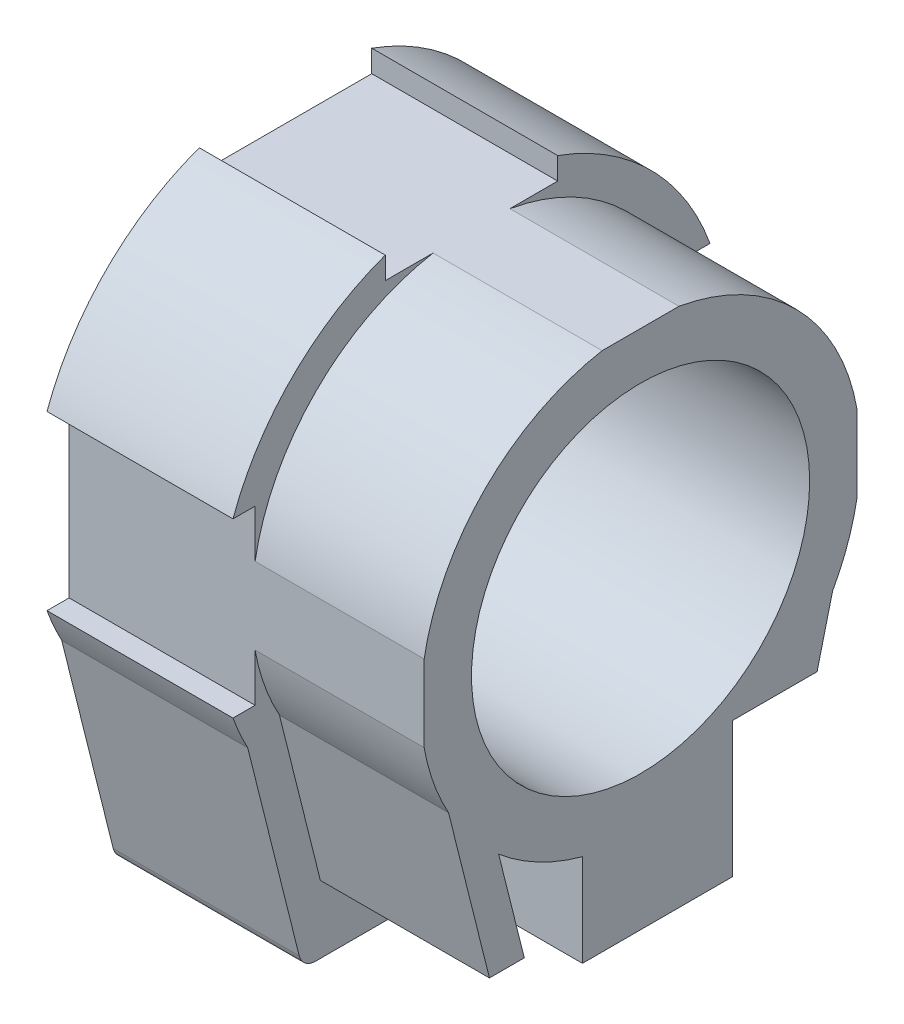
ISO-10303-21;
HEADER;
FILE_DESCRIPTION(('STEP AP214'),'2;1');
FILE_NAME('part.step','',(''),(''),'','','');
FILE_SCHEMA(('AUTOMOTIVE_DESIGN { 1 0 10303 214 1 1 1 1 }'));
ENDSEC;
DATA;
#1=APPLICATION_CONTEXT('core data for automotive mechanical design processes');
#2=APPLICATION_PROTOCOL_DEFINITION('international standard','automotive_design',2000,#1);
#3=PRODUCT_CONTEXT('',#1,'mechanical');
#4=PRODUCT('Part','Part','',(#3));
#5=PRODUCT_RELATED_PRODUCT_CATEGORY('part','',(#4));
#6=PRODUCT_DEFINITION_FORMATION('','',#4);
#7=PRODUCT_DEFINITION_CONTEXT('part definition',#1,'design');
#8=PRODUCT_DEFINITION('design','',#6,#7);
#9=PRODUCT_DEFINITION_SHAPE('','',#8);
#10=(LENGTH_UNIT() NAMED_UNIT(*) SI_UNIT(.MILLI.,.METRE.));
#11=(NAMED_UNIT(*) PLANE_ANGLE_UNIT() SI_UNIT($,.RADIAN.));
#12=(NAMED_UNIT(*) SI_UNIT($,.STERADIAN.) SOLID_ANGLE_UNIT());
#13=UNCERTAINTY_MEASURE_WITH_UNIT(LENGTH_MEASURE(1.E-05),#10,'distance_accuracy_value','');
#14=(GEOMETRIC_REPRESENTATION_CONTEXT(3) GLOBAL_UNCERTAINTY_ASSIGNED_CONTEXT((#13)) GLOBAL_UNIT_ASSIGNED_CONTEXT((#10,
#11,#12)) REPRESENTATION_CONTEXT('',''));
#15=CARTESIAN_POINT('',(0.,0.,0.));
#16=DIRECTION('',(0.,0.,1.));
#17=DIRECTION('',(1.,0.,0.));
#18=AXIS2_PLACEMENT_3D('',#15,#16,#17);
#19=CARTESIAN_POINT('',(11.,0.999999999999997,24.2192235935956));
#20=DIRECTION('',(-1.,0.,0.));
#21=DIRECTION('',(0.,0.,1.));
#22=AXIS2_PLACEMENT_3D('',#19,#20,#21);
#23=PLANE('',#22);
#24=CARTESIAN_POINT('',(11.,20.,15.));
#25=DIRECTION('',(1.,0.,0.));
#26=DIRECTION('',(0.,0.,-1.));
#27=AXIS2_PLACEMENT_3D('',#24,#25,#26);
#28=CIRCLE('',#27,15.);
#29=CARTESIAN_POINT('',(11.,34.1063815346105,20.1));
#30=VERTEX_POINT('',#29);
#31=CARTESIAN_POINT('',(11.,25.0999999999999,29.1063815346105));
#32=VERTEX_POINT('',#31);
#33=EDGE_CURVE('E716',#30,#32,#28,.T.);
#34=ORIENTED_EDGE('',*,*,#33,.T.);
#35=DIRECTION('',(0.,0.,1.));
#36=VECTOR('',#35,1.);
#37=CARTESIAN_POINT('',(11.,25.0999999999999,27.8));
#38=LINE('',#37,#36);
#39=CARTESIAN_POINT('',(11.,25.0999999999999,27.8));
#40=VERTEX_POINT('',#39);
#41=EDGE_CURVE('E276',#40,#32,#38,.T.);
#42=ORIENTED_EDGE('',*,*,#41,.F.);
#43=DIRECTION('',(0.,1.,0.));
#44=VECTOR('',#43,1.);
#45=CARTESIAN_POINT('',(11.,19.9999999999999,27.8));
#46=LINE('',#45,#44);
#47=CARTESIAN_POINT('',(11.,22.2715633383201,27.8));
#48=VERTEX_POINT('',#47);
#49=EDGE_CURVE('E262',#48,#40,#46,.T.);
#50=ORIENTED_EDGE('',*,*,#49,.F.);
#51=CARTESIAN_POINT('',(11.,20.,15.));
#52=DIRECTION('',(1.,0.,0.));
#53=DIRECTION('',(0.,0.,-1.));
#54=AXIS2_PLACEMENT_3D('',#51,#52,#53);
#55=CIRCLE('',#54,13.);
#56=CARTESIAN_POINT('',(11.,32.8,17.2715633383201));
#57=VERTEX_POINT('',#56);
#58=EDGE_CURVE('E275',#57,#48,#55,.T.);
#59=ORIENTED_EDGE('',*,*,#58,.F.);
#60=DIRECTION('',(0.,0.,-1.));
#61=VECTOR('',#60,1.);
#62=CARTESIAN_POINT('',(11.,32.8,15.));
#63=LINE('',#62,#61);
#64=CARTESIAN_POINT('',(11.,32.8,20.1));
#65=VERTEX_POINT('',#64);
#66=EDGE_CURVE('E458',#65,#57,#63,.T.);
#67=ORIENTED_EDGE('',*,*,#66,.F.);
#68=DIRECTION('',(0.,-1.,0.));
#69=VECTOR('',#68,1.);
#70=CARTESIAN_POINT('',(11.,32.8,20.1));
#71=LINE('',#70,#69);
#72=EDGE_CURVE('E451',#30,#65,#71,.T.);
#73=ORIENTED_EDGE('',*,*,#72,.F.);
#74=EDGE_LOOP('',(#34,#42,#50,#59,#67,#73));
#75=FACE_BOUND('',#74,.T.);
#76=ADVANCED_FACE('F39',(#75),#23,.F.);
#77=CARTESIAN_POINT('',(11.,14.8999999999999,27.8));
#78=VERTEX_POINT('',#77);
#79=CARTESIAN_POINT('',(11.,17.7284366616799,27.8));
#80=VERTEX_POINT('',#79);
#81=EDGE_CURVE('E280',#78,#80,#46,.T.);
#82=ORIENTED_EDGE('',*,*,#81,.F.);
#83=DIRECTION('',(0.,0.,-1.));
#84=VECTOR('',#83,1.);
#85=CARTESIAN_POINT('',(11.,14.8999999999999,27.8));
#86=LINE('',#85,#84);
#87=CARTESIAN_POINT('',(11.,14.8999999999999,29.1063815346104));
#88=VERTEX_POINT('',#87);
#89=EDGE_CURVE('E687',#88,#78,#86,.T.);
#90=ORIENTED_EDGE('',*,*,#89,.F.);
#91=CARTESIAN_POINT('',(11.,12.9411764705883,28.2352941176471));
#92=VERTEX_POINT('',#91);
#93=EDGE_CURVE('E327',#88,#92,#28,.T.);
#94=ORIENTED_EDGE('',*,*,#93,.T.);
#95=DIRECTION('',(0.,-0.970142500145332,-0.242535625036334));
#96=VECTOR('',#95,1.);
#97=CARTESIAN_POINT('',(11.,12.9411764705883,28.2352941176471));
#98=LINE('',#97,#96);
#99=CARTESIAN_POINT('',(11.,0.757464374963668,25.1893660937409));
#100=VERTEX_POINT('',#99);
#101=EDGE_CURVE('E332',#92,#100,#98,.T.);
#102=ORIENTED_EDGE('',*,*,#101,.T.);
#103=CARTESIAN_POINT('',(11.,0.999999999999997,24.2192235935956));
#104=DIRECTION('',(1.,0.,0.));
#105=DIRECTION('',(0.,0.,1.));
#106=AXIS2_PLACEMENT_3D('',#103,#104,#105);
#107=CIRCLE('',#106,0.999999999999999);
#108=CARTESIAN_POINT('',(11.,0.,24.2192235935956));
#109=VERTEX_POINT('',#108);
#110=EDGE_CURVE('E313',#100,#109,#107,.T.);
#111=ORIENTED_EDGE('',*,*,#110,.T.);
#112=DIRECTION('',(0.,0.,-1.));
#113=VECTOR('',#112,1.);
#114=CARTESIAN_POINT('',(11.,0.,5.78077640640443));
#115=LINE('',#114,#113);
#116=CARTESIAN_POINT('',(11.,0.,5.78077640640443));
#117=VERTEX_POINT('',#116);
#118=EDGE_CURVE('E317',#109,#117,#115,.T.);
#119=ORIENTED_EDGE('',*,*,#118,.T.);
#120=CARTESIAN_POINT('',(11.,0.999999999999998,5.78077640640442));
#121=DIRECTION('',(1.,0.,0.));
#122=DIRECTION('',(0.,0.,-1.));
#123=AXIS2_PLACEMENT_3D('',#120,#121,#122);
#124=CIRCLE('',#123,1.);
#125=CARTESIAN_POINT('',(11.,0.757464374963669,4.81063390625909));
#126=VERTEX_POINT('',#125);
#127=EDGE_CURVE('E321',#117,#126,#124,.T.);
#128=ORIENTED_EDGE('',*,*,#127,.T.);
#129=DIRECTION('',(0.,0.970142500145332,-0.242535625036333));
#130=VECTOR('',#129,1.);
#131=CARTESIAN_POINT('',(11.,12.9411764705883,1.76470588235294));
#132=LINE('',#131,#130);
#133=CARTESIAN_POINT('',(11.,12.9411764705883,1.76470588235294));
#134=VERTEX_POINT('',#133);
#135=EDGE_CURVE('E324',#126,#134,#132,.T.);
#136=ORIENTED_EDGE('',*,*,#135,.T.);
#137=CARTESIAN_POINT('',(11.,14.8999999999999,0.893618465389543));
#138=VERTEX_POINT('',#137);
#139=EDGE_CURVE('E328',#134,#138,#28,.T.);
#140=ORIENTED_EDGE('',*,*,#139,.T.);
#141=DIRECTION('',(0.,0.,-1.));
#142=VECTOR('',#141,1.);
#143=CARTESIAN_POINT('',(11.,14.8999999999999,2.20000000000001));
#144=LINE('',#143,#142);
#145=CARTESIAN_POINT('',(11.,14.8999999999999,2.20000000000001));
#146=VERTEX_POINT('',#145);
#147=EDGE_CURVE('E402',#146,#138,#144,.T.);
#148=ORIENTED_EDGE('',*,*,#147,.F.);
#149=DIRECTION('',(0.,-1.,0.));
#150=VECTOR('',#149,1.);
#151=CARTESIAN_POINT('',(11.,19.9999999999999,2.20000000000001));
#152=LINE('',#151,#150);
#153=CARTESIAN_POINT('',(11.,17.7284366616799,2.20000000000001));
#154=VERTEX_POINT('',#153);
#155=EDGE_CURVE('E518',#154,#146,#152,.T.);
#156=ORIENTED_EDGE('',*,*,#155,.F.);
#157=CARTESIAN_POINT('',(11.,13.6737885517657,3.64310567486741));
#158=VERTEX_POINT('',#157);
#159=EDGE_CURVE('E291',#158,#154,#55,.T.);
#160=ORIENTED_EDGE('',*,*,#159,.F.);
#161=DIRECTION('',(0.,0.970142500145332,-0.242535625036333));
#162=VECTOR('',#161,1.);
#163=CARTESIAN_POINT('',(11.,2.,6.56155281280884));
#164=LINE('',#163,#162);
#165=CARTESIAN_POINT('',(11.,10.,4.56155281280884));
#166=VERTEX_POINT('',#165);
#167=EDGE_CURVE('E292',#166,#158,#164,.T.);
#168=ORIENTED_EDGE('',*,*,#167,.F.);
#169=DIRECTION('',(0.,0.,1.));
#170=VECTOR('',#169,1.);
#171=CARTESIAN_POINT('',(11.,10.,9.56155281280883));
#172=LINE('',#171,#170);
#173=CARTESIAN_POINT('',(11.,10.,9.56155281280883));
#174=VERTEX_POINT('',#173);
#175=EDGE_CURVE('E535',#166,#174,#172,.T.);
#176=ORIENTED_EDGE('',*,*,#175,.T.);
#177=DIRECTION('',(0.,-1.,0.));
#178=VECTOR('',#177,1.);
#179=CARTESIAN_POINT('',(11.,2.,9.56155281280884));
#180=LINE('',#179,#178);
#181=CARTESIAN_POINT('',(11.,2.,9.56155281280884));
#182=VERTEX_POINT('',#181);
#183=EDGE_CURVE('E539',#174,#182,#180,.T.);
#184=ORIENTED_EDGE('',*,*,#183,.T.);
#185=DIRECTION('',(0.,0.,-1.));
#186=VECTOR('',#185,1.);
#187=CARTESIAN_POINT('',(11.,2.,23.4384471871912));
#188=LINE('',#187,#186);
#189=CARTESIAN_POINT('',(11.,2.,18.4384471871912));
#190=VERTEX_POINT('',#189);
#191=EDGE_CURVE('E626',#190,#182,#188,.T.);
#192=ORIENTED_EDGE('',*,*,#191,.F.);
#193=DIRECTION('',(0.,1.,0.));
#194=VECTOR('',#193,1.);
#195=CARTESIAN_POINT('',(11.,2.,18.4384471871912));
#196=LINE('',#195,#194);
#197=CARTESIAN_POINT('',(11.,7.46297160644129,18.4384471871912));
#198=VERTEX_POINT('',#197);
#199=EDGE_CURVE('E570',#190,#198,#196,.T.);
#200=ORIENTED_EDGE('',*,*,#199,.T.);
#201=CARTESIAN_POINT('',(11.,20.,15.));
#202=DIRECTION('',(-1.,0.,0.));
#203=DIRECTION('',(0.,0.,-1.));
#204=AXIS2_PLACEMENT_3D('',#201,#202,#203);
#205=CIRCLE('',#204,13.);
#206=CARTESIAN_POINT('',(11.,10.0745188980685,23.3955240988995));
#207=VERTEX_POINT('',#206);
#208=EDGE_CURVE('E573',#198,#207,#205,.T.);
#209=ORIENTED_EDGE('',*,*,#208,.T.);
#210=DIRECTION('',(0.,-0.970142500145333,-0.24253562503633));
#211=VECTOR('',#210,1.);
#212=CARTESIAN_POINT('',(11.,9.27078631172835,23.1945909523144));
#213=LINE('',#212,#211);
#214=CARTESIAN_POINT('',(11.,4.,21.8768943743823));
#215=VERTEX_POINT('',#214);
#216=EDGE_CURVE('E562',#207,#215,#213,.T.);
#217=ORIENTED_EDGE('',*,*,#216,.T.);
#218=DIRECTION('',(0.,0.,1.));
#219=VECTOR('',#218,1.);
#220=CARTESIAN_POINT('',(11.,4.,21.8768943743823));
#221=LINE('',#220,#219);
#222=CARTESIAN_POINT('',(11.,4.,23.9384471871912));
#223=VERTEX_POINT('',#222);
#224=EDGE_CURVE('E565',#215,#223,#221,.T.);
#225=ORIENTED_EDGE('',*,*,#224,.T.);
#226=DIRECTION('',(0.,-0.970142500145332,-0.242535625036334));
#227=VECTOR('',#226,1.);
#228=CARTESIAN_POINT('',(11.,13.6737885517657,26.3568943251326));
#229=LINE('',#228,#227);
#230=CARTESIAN_POINT('',(11.,13.6737885517657,26.3568943251326));
#231=VERTEX_POINT('',#230);
#232=EDGE_CURVE('E608',#231,#223,#229,.T.);
#233=ORIENTED_EDGE('',*,*,#232,.F.);
#234=EDGE_CURVE('E286',#80,#231,#55,.T.);
#235=ORIENTED_EDGE('',*,*,#234,.F.);
#236=EDGE_LOOP('',(#82,#90,#94,#102,#111,#119,#128,#136,#140,#148,#156,#160,#168,#176,#184,#192,
#200,#209,#217,#225,#233,#235));
#237=FACE_BOUND('',#236,.T.);
#238=ADVANCED_FACE('F400',(#237),#23,.F.);
#239=CARTESIAN_POINT('',(11.,20.,15.));
#240=DIRECTION('',(-1.,0.,0.));
#241=DIRECTION('',(0.,0.,1.));
#242=AXIS2_PLACEMENT_3D('',#239,#240,#241);
#243=CYLINDRICAL_SURFACE('',#242,15.);
#244=CARTESIAN_POINT('',(0.,20.,15.));
#245=DIRECTION('',(1.,0.,0.));
#246=DIRECTION('',(0.,0.,-1.));
#247=AXIS2_PLACEMENT_3D('',#244,#245,#246);
#248=CIRCLE('',#247,15.);
#249=CARTESIAN_POINT('',(0.,34.1063815346105,20.1));
#250=VERTEX_POINT('',#249);
#251=CARTESIAN_POINT('',(0.,25.0999999999999,29.1063815346105));
#252=VERTEX_POINT('',#251);
#253=EDGE_CURVE('E421',#250,#252,#248,.T.);
#254=ORIENTED_EDGE('',*,*,#253,.T.);
#255=DIRECTION('',(-1.,0.,0.));
#256=VECTOR('',#255,1.);
#257=CARTESIAN_POINT('',(21.001,25.0999999999999,29.1063815346105));
#258=LINE('',#257,#256);
#259=EDGE_CURVE('E717',#32,#252,#258,.T.);
#260=ORIENTED_EDGE('',*,*,#259,.F.);
#261=ORIENTED_EDGE('',*,*,#33,.F.);
#262=DIRECTION('',(-1.,0.,0.));
#263=VECTOR('',#262,1.);
#264=CARTESIAN_POINT('',(21.001,34.1063815346105,20.1));
#265=LINE('',#264,#263);
#266=EDGE_CURVE('E464',#30,#250,#265,.T.);
#267=ORIENTED_EDGE('',*,*,#266,.T.);
#268=EDGE_LOOP('',(#254,#260,#261,#267));
#269=FACE_BOUND('',#268,.T.);
#270=ADVANCED_FACE('F715',(#269),#243,.T.);
#271=ORIENTED_EDGE('',*,*,#93,.F.);
#272=DIRECTION('',(-1.,0.,0.));
#273=VECTOR('',#272,1.);
#274=CARTESIAN_POINT('',(21.001,14.8999999999999,29.1063815346104));
#275=LINE('',#274,#273);
#276=CARTESIAN_POINT('',(0.,14.8999999999999,29.1063815346104));
#277=VERTEX_POINT('',#276);
#278=EDGE_CURVE('E419',#88,#277,#275,.T.);
#279=ORIENTED_EDGE('',*,*,#278,.T.);
#280=CARTESIAN_POINT('',(0.,12.9411764705883,28.2352941176471));
#281=VERTEX_POINT('',#280);
#282=EDGE_CURVE('E349',#277,#281,#248,.T.);
#283=ORIENTED_EDGE('',*,*,#282,.T.);
#284=DIRECTION('',(-1.,0.,0.));
#285=VECTOR('',#284,1.);
#286=CARTESIAN_POINT('',(11.,12.9411764705883,28.2352941176471));
#287=LINE('',#286,#285);
#288=EDGE_CURVE('E360',#92,#281,#287,.T.);
#289=ORIENTED_EDGE('',*,*,#288,.F.);
#290=EDGE_LOOP('',(#271,#279,#283,#289));
#291=FACE_BOUND('',#290,.T.);
#292=ADVANCED_FACE('F417',(#291),#243,.T.);
#293=CARTESIAN_POINT('',(0.,12.9411764705883,1.76470588235294));
#294=VERTEX_POINT('',#293);
#295=CARTESIAN_POINT('',(0.,14.8999999999999,0.893618465389543));
#296=VERTEX_POINT('',#295);
#297=EDGE_CURVE('E350',#294,#296,#248,.T.);
#298=ORIENTED_EDGE('',*,*,#297,.T.);
#299=DIRECTION('',(-1.,0.,0.));
#300=VECTOR('',#299,1.);
#301=CARTESIAN_POINT('',(21.001,14.8999999999999,0.893618465389543));
#302=LINE('',#301,#300);
#303=EDGE_CURVE('E396',#138,#296,#302,.T.);
#304=ORIENTED_EDGE('',*,*,#303,.F.);
#305=ORIENTED_EDGE('',*,*,#139,.F.);
#306=DIRECTION('',(-1.,0.,0.));
#307=VECTOR('',#306,1.);
#308=CARTESIAN_POINT('',(11.,12.9411764705883,1.76470588235294));
#309=LINE('',#308,#307);
#310=EDGE_CURVE('E364',#134,#294,#309,.T.);
#311=ORIENTED_EDGE('',*,*,#310,.T.);
#312=EDGE_LOOP('',(#298,#304,#305,#311));
#313=FACE_BOUND('',#312,.T.);
#314=ADVANCED_FACE('F394',(#313),#243,.T.);
#315=CARTESIAN_POINT('',(21.,20.,15.));
#316=DIRECTION('',(-1.,0.,0.));
#317=DIRECTION('',(0.,0.,1.));
#318=AXIS2_PLACEMENT_3D('',#315,#316,#317);
#319=CYLINDRICAL_SURFACE('',#318,13.);
#320=CARTESIAN_POINT('',(21.,20.,15.));
#321=DIRECTION('',(1.,0.,0.));
#322=DIRECTION('',(0.,0.,-1.));
#323=AXIS2_PLACEMENT_3D('',#320,#321,#322);
#324=CIRCLE('',#323,13.);
#325=CARTESIAN_POINT('',(21.,17.7284366616799,27.8));
#326=VERTEX_POINT('',#325);
#327=CARTESIAN_POINT('',(21.,13.6737885517657,26.3568943251326));
#328=VERTEX_POINT('',#327);
#329=EDGE_CURVE('E619',#326,#328,#324,.T.);
#330=ORIENTED_EDGE('',*,*,#329,.F.);
#331=DIRECTION('',(-1.,0.,0.));
#332=VECTOR('',#331,1.);
#333=CARTESIAN_POINT('',(21.,17.7284366616799,27.8));
#334=LINE('',#333,#332);
#335=EDGE_CURVE('E278',#80,#326,#334,.F.);
#336=ORIENTED_EDGE('',*,*,#335,.F.);
#337=ORIENTED_EDGE('',*,*,#234,.T.);
#338=DIRECTION('',(-1.,0.,0.));
#339=VECTOR('',#338,1.);
#340=CARTESIAN_POINT('',(21.,13.6737885517657,26.3568943251326));
#341=LINE('',#340,#339);
#342=EDGE_CURVE('E299',#328,#231,#341,.T.);
#343=ORIENTED_EDGE('',*,*,#342,.F.);
#344=EDGE_LOOP('',(#330,#336,#337,#343));
#345=FACE_BOUND('',#344,.T.);
#346=ADVANCED_FACE('F683',(#345),#319,.T.);
#347=ORIENTED_EDGE('',*,*,#58,.T.);
#348=DIRECTION('',(-1.,0.,0.));
#349=VECTOR('',#348,1.);
#350=CARTESIAN_POINT('',(21.,22.2715633383201,27.8));
#351=LINE('',#350,#349);
#352=CARTESIAN_POINT('',(21.,22.2715633383201,27.8));
#353=VERTEX_POINT('',#352);
#354=EDGE_CURVE('E259',#353,#48,#351,.T.);
#355=ORIENTED_EDGE('',*,*,#354,.F.);
#356=CARTESIAN_POINT('',(21.,32.8,17.2715633383201));
#357=VERTEX_POINT('',#356);
#358=EDGE_CURVE('E721',#357,#353,#324,.T.);
#359=ORIENTED_EDGE('',*,*,#358,.F.);
#360=DIRECTION('',(-1.,0.,0.));
#361=VECTOR('',#360,1.);
#362=CARTESIAN_POINT('',(21.,32.8,17.2715633383201));
#363=LINE('',#362,#361);
#364=EDGE_CURVE('E283',#57,#357,#363,.F.);
#365=ORIENTED_EDGE('',*,*,#364,.F.);
#366=EDGE_LOOP('',(#347,#355,#359,#365));
#367=FACE_BOUND('',#366,.T.);
#368=ADVANCED_FACE('F282',(#367),#319,.T.);
#369=CARTESIAN_POINT('',(11.,22.2715633383201,2.20000000000001));
#370=VERTEX_POINT('',#369);
#371=CARTESIAN_POINT('',(11.,32.8,12.7284366616799));
#372=VERTEX_POINT('',#371);
#373=EDGE_CURVE('E285',#370,#372,#55,.T.);
#374=ORIENTED_EDGE('',*,*,#373,.T.);
#375=DIRECTION('',(-1.,0.,0.));
#376=VECTOR('',#375,1.);
#377=CARTESIAN_POINT('',(21.,32.8,12.7284366616799));
#378=LINE('',#377,#376);
#379=CARTESIAN_POINT('',(21.,32.8,12.7284366616799));
#380=VERTEX_POINT('',#379);
#381=EDGE_CURVE('E478',#380,#372,#378,.T.);
#382=ORIENTED_EDGE('',*,*,#381,.F.);
#383=CARTESIAN_POINT('',(21.,22.2715633383201,2.20000000000001));
#384=VERTEX_POINT('',#383);
#385=EDGE_CURVE('E623',#384,#380,#324,.T.);
#386=ORIENTED_EDGE('',*,*,#385,.F.);
#387=DIRECTION('',(-1.,0.,0.));
#388=VECTOR('',#387,1.);
#389=CARTESIAN_POINT('',(21.,22.2715633383201,2.20000000000001));
#390=LINE('',#389,#388);
#391=EDGE_CURVE('E522',#370,#384,#390,.F.);
#392=ORIENTED_EDGE('',*,*,#391,.F.);
#393=EDGE_LOOP('',(#374,#382,#386,#392));
#394=FACE_BOUND('',#393,.T.);
#395=ADVANCED_FACE('F707',(#394),#319,.T.);
#396=DIRECTION('',(0.,1.,0.));
#397=VECTOR('',#396,1.);
#398=CARTESIAN_POINT('',(11.,32.8,9.9));
#399=LINE('',#398,#397);
#400=CARTESIAN_POINT('',(11.,32.8,9.9));
#401=VERTEX_POINT('',#400);
#402=CARTESIAN_POINT('',(11.,34.1063815346105,9.9));
#403=VERTEX_POINT('',#402);
#404=EDGE_CURVE('E467',#401,#403,#399,.T.);
#405=ORIENTED_EDGE('',*,*,#404,.F.);
#406=EDGE_CURVE('E692',#372,#401,#63,.T.);
#407=ORIENTED_EDGE('',*,*,#406,.F.);
#408=ORIENTED_EDGE('',*,*,#373,.F.);
#409=CARTESIAN_POINT('',(11.,25.0999999999999,2.20000000000001));
#410=VERTEX_POINT('',#409);
#411=EDGE_CURVE('E523',#410,#370,#152,.T.);
#412=ORIENTED_EDGE('',*,*,#411,.F.);
#413=DIRECTION('',(0.,0.,1.));
#414=VECTOR('',#413,1.);
#415=CARTESIAN_POINT('',(11.,25.0999999999999,2.20000000000001));
#416=LINE('',#415,#414);
#417=CARTESIAN_POINT('',(11.,25.0999999999999,0.893618465389472));
#418=VERTEX_POINT('',#417);
#419=EDGE_CURVE('E487',#418,#410,#416,.T.);
#420=ORIENTED_EDGE('',*,*,#419,.F.);
#421=EDGE_CURVE('E333',#418,#403,#28,.T.);
#422=ORIENTED_EDGE('',*,*,#421,.T.);
#423=EDGE_LOOP('',(#405,#407,#408,#412,#420,#422));
#424=FACE_BOUND('',#423,.T.);
#425=ADVANCED_FACE('F708',(#424),#23,.F.);
#426=CARTESIAN_POINT('',(0.,0.999999999999997,24.2192235935956));
#427=DIRECTION('',(-1.,0.,0.));
#428=DIRECTION('',(0.,0.,1.));
#429=AXIS2_PLACEMENT_3D('',#426,#427,#428);
#430=PLANE('',#429);
#431=DIRECTION('',(0.,0.,-1.));
#432=VECTOR('',#431,1.);
#433=CARTESIAN_POINT('',(0.,25.0999999999999,27.8));
#434=LINE('',#433,#432);
#435=CARTESIAN_POINT('',(0.,25.0999999999999,27.8));
#436=VERTEX_POINT('',#435);
#437=EDGE_CURVE('E735',#252,#436,#434,.T.);
#438=ORIENTED_EDGE('',*,*,#437,.F.);
#439=ORIENTED_EDGE('',*,*,#253,.F.);
#440=DIRECTION('',(0.,1.,0.));
#441=VECTOR('',#440,1.);
#442=CARTESIAN_POINT('',(0.,32.8,20.1));
#443=LINE('',#442,#441);
#444=CARTESIAN_POINT('',(0.,32.8,20.1));
#445=VERTEX_POINT('',#444);
#446=EDGE_CURVE('E455',#445,#250,#443,.T.);
#447=ORIENTED_EDGE('',*,*,#446,.F.);
#448=DIRECTION('',(0.,0.,1.));
#449=VECTOR('',#448,1.);
#450=CARTESIAN_POINT('',(0.,32.8,15.));
#451=LINE('',#450,#449);
#452=CARTESIAN_POINT('',(0.,32.8,9.9));
#453=VERTEX_POINT('',#452);
#454=EDGE_CURVE('E448',#453,#445,#451,.T.);
#455=ORIENTED_EDGE('',*,*,#454,.F.);
#456=DIRECTION('',(0.,-1.,0.));
#457=VECTOR('',#456,1.);
#458=CARTESIAN_POINT('',(0.,32.8,9.9));
#459=LINE('',#458,#457);
#460=CARTESIAN_POINT('',(0.,34.1063815346105,9.9));
#461=VERTEX_POINT('',#460);
#462=EDGE_CURVE('E445',#461,#453,#459,.T.);
#463=ORIENTED_EDGE('',*,*,#462,.F.);
#464=CARTESIAN_POINT('',(0.,25.0999999999999,0.893618465389472));
#465=VERTEX_POINT('',#464);
#466=EDGE_CURVE('E354',#465,#461,#248,.T.);
#467=ORIENTED_EDGE('',*,*,#466,.F.);
#468=DIRECTION('',(0.,0.,-1.));
#469=VECTOR('',#468,1.);
#470=CARTESIAN_POINT('',(0.,25.0999999999999,2.20000000000001));
#471=LINE('',#470,#469);
#472=CARTESIAN_POINT('',(0.,25.0999999999999,2.20000000000001));
#473=VERTEX_POINT('',#472);
#474=EDGE_CURVE('E442',#473,#465,#471,.T.);
#475=ORIENTED_EDGE('',*,*,#474,.F.);
#476=DIRECTION('',(0.,1.,0.));
#477=VECTOR('',#476,1.);
#478=CARTESIAN_POINT('',(0.,19.9999999999999,2.20000000000001));
#479=LINE('',#478,#477);
#480=CARTESIAN_POINT('',(0.,14.8999999999999,2.20000000000001));
#481=VERTEX_POINT('',#480);
#482=EDGE_CURVE('E491',#481,#473,#479,.T.);
#483=ORIENTED_EDGE('',*,*,#482,.F.);
#484=DIRECTION('',(0.,0.,1.));
#485=VECTOR('',#484,1.);
#486=CARTESIAN_POINT('',(0.,14.8999999999999,2.20000000000001));
#487=LINE('',#486,#485);
#488=EDGE_CURVE('E497',#296,#481,#487,.T.);
#489=ORIENTED_EDGE('',*,*,#488,.F.);
#490=ORIENTED_EDGE('',*,*,#297,.F.);
#491=DIRECTION('',(0.,0.970142500145332,-0.242535625036333));
#492=VECTOR('',#491,1.);
#493=CARTESIAN_POINT('',(0.,12.9411764705883,1.76470588235294));
#494=LINE('',#493,#492);
#495=CARTESIAN_POINT('',(0.,0.757464374963669,4.81063390625909));
#496=VERTEX_POINT('',#495);
#497=EDGE_CURVE('E346',#496,#294,#494,.T.);
#498=ORIENTED_EDGE('',*,*,#497,.F.);
#499=CARTESIAN_POINT('',(0.,0.999999999999998,5.78077640640442));
#500=DIRECTION('',(1.,0.,0.));
#501=DIRECTION('',(0.,0.,-1.));
#502=AXIS2_PLACEMENT_3D('',#499,#500,#501);
#503=CIRCLE('',#502,1.);
#504=CARTESIAN_POINT('',(0.,0.,5.78077640640443));
#505=VERTEX_POINT('',#504);
#506=EDGE_CURVE('E343',#505,#496,#503,.T.);
#507=ORIENTED_EDGE('',*,*,#506,.F.);
#508=DIRECTION('',(0.,0.,-1.));
#509=VECTOR('',#508,1.);
#510=CARTESIAN_POINT('',(0.,0.,5.78077640640443));
#511=LINE('',#510,#509);
#512=CARTESIAN_POINT('',(0.,0.,24.2192235935956));
#513=VERTEX_POINT('',#512);
#514=EDGE_CURVE('E340',#513,#505,#511,.T.);
#515=ORIENTED_EDGE('',*,*,#514,.F.);
#516=CARTESIAN_POINT('',(0.,0.999999999999997,24.2192235935956));
#517=DIRECTION('',(1.,0.,0.));
#518=DIRECTION('',(0.,0.,1.));
#519=AXIS2_PLACEMENT_3D('',#516,#517,#518);
#520=CIRCLE('',#519,0.999999999999999);
#521=CARTESIAN_POINT('',(0.,0.757464374963668,25.1893660937409));
#522=VERTEX_POINT('',#521);
#523=EDGE_CURVE('E312',#522,#513,#520,.T.);
#524=ORIENTED_EDGE('',*,*,#523,.F.);
#525=DIRECTION('',(0.,-0.970142500145332,-0.242535625036334));
#526=VECTOR('',#525,1.);
#527=CARTESIAN_POINT('',(0.,12.9411764705883,28.2352941176471));
#528=LINE('',#527,#526);
#529=EDGE_CURVE('E318',#281,#522,#528,.T.);
#530=ORIENTED_EDGE('',*,*,#529,.F.);
#531=ORIENTED_EDGE('',*,*,#282,.F.);
#532=DIRECTION('',(0.,0.,1.));
#533=VECTOR('',#532,1.);
#534=CARTESIAN_POINT('',(0.,14.8999999999999,27.8));
#535=LINE('',#534,#533);
#536=CARTESIAN_POINT('',(0.,14.8999999999999,27.8));
#537=VERTEX_POINT('',#536);
#538=EDGE_CURVE('E739',#537,#277,#535,.T.);
#539=ORIENTED_EDGE('',*,*,#538,.F.);
#540=DIRECTION('',(0.,-1.,0.));
#541=VECTOR('',#540,1.);
#542=CARTESIAN_POINT('',(0.,19.9999999999999,27.8));
#543=LINE('',#542,#541);
#544=EDGE_CURVE('E742',#436,#537,#543,.T.);
#545=ORIENTED_EDGE('',*,*,#544,.F.);
#546=EDGE_LOOP('',(#438,#439,#447,#455,#463,#467,#475,#483,#489,#490,#498,#507,#515,#524,#530,
#531,#539,#545));
#547=FACE_BOUND('',#546,.T.);
#548=CARTESIAN_POINT('',(0.,20.,15.));
#549=DIRECTION('',(1.,0.,0.));
#550=DIRECTION('',(0.,0.,-1.));
#551=AXIS2_PLACEMENT_3D('',#548,#549,#550);
#552=CIRCLE('',#551,10.);
#553=CARTESIAN_POINT('',(0.,20.,4.99999999999999));
#554=VERTEX_POINT('',#553);
#555=EDGE_CURVE('E308',#554,#554,#552,.T.);
#556=ORIENTED_EDGE('',*,*,#555,.T.);
#557=EDGE_LOOP('',(#556));
#558=FACE_BOUND('',#557,.T.);
#559=ADVANCED_FACE('F383',(#547,#558),#430,.T.);
#560=CARTESIAN_POINT('',(11.,0.999999999999997,24.2192235935956));
#561=DIRECTION('',(-1.,0.,0.));
#562=DIRECTION('',(0.,0.,1.));
#563=AXIS2_PLACEMENT_3D('',#560,#561,#562);
#564=CYLINDRICAL_SURFACE('',#563,0.999999999999999);
#565=ORIENTED_EDGE('',*,*,#523,.T.);
#566=DIRECTION('',(-1.,0.,0.));
#567=VECTOR('',#566,1.);
#568=CARTESIAN_POINT('',(11.,0.,24.2192235935956));
#569=LINE('',#568,#567);
#570=EDGE_CURVE('E11',#109,#513,#569,.T.);
#571=ORIENTED_EDGE('',*,*,#570,.F.);
#572=ORIENTED_EDGE('',*,*,#110,.F.);
#573=DIRECTION('',(-1.,0.,0.));
#574=VECTOR('',#573,1.);
#575=CARTESIAN_POINT('',(11.,0.757464374963668,25.1893660937409));
#576=LINE('',#575,#574);
#577=EDGE_CURVE('E336',#100,#522,#576,.T.);
#578=ORIENTED_EDGE('',*,*,#577,.T.);
#579=EDGE_LOOP('',(#565,#571,#572,#578));
#580=FACE_BOUND('',#579,.T.);
#581=ADVANCED_FACE('F41',(#580),#564,.T.);
#582=CARTESIAN_POINT('',(11.,0.,5.78077640640443));
#583=DIRECTION('',(0.,1.,0.));
#584=DIRECTION('',(0.,0.,1.));
#585=AXIS2_PLACEMENT_3D('',#582,#583,#584);
#586=PLANE('',#585);
#587=ORIENTED_EDGE('',*,*,#514,.T.);
#588=DIRECTION('',(-1.,0.,0.));
#589=VECTOR('',#588,1.);
#590=CARTESIAN_POINT('',(11.,0.,5.78077640640443));
#591=LINE('',#590,#589);
#592=EDGE_CURVE('E48',#117,#505,#591,.T.);
#593=ORIENTED_EDGE('',*,*,#592,.F.);
#594=ORIENTED_EDGE('',*,*,#118,.F.);
#595=ORIENTED_EDGE('',*,*,#570,.T.);
#596=EDGE_LOOP('',(#587,#593,#594,#595));
#597=FACE_BOUND('',#596,.T.);
#598=ADVANCED_FACE('F405',(#597),#586,.F.);
#599=CARTESIAN_POINT('',(11.,0.999999999999998,5.78077640640442));
#600=DIRECTION('',(-1.,0.,0.));
#601=DIRECTION('',(0.,0.,1.));
#602=AXIS2_PLACEMENT_3D('',#599,#600,#601);
#603=CYLINDRICAL_SURFACE('',#602,1.);
#604=ORIENTED_EDGE('',*,*,#506,.T.);
#605=DIRECTION('',(-1.,0.,0.));
#606=VECTOR('',#605,1.);
#607=CARTESIAN_POINT('',(11.,0.757464374963669,4.81063390625909));
#608=LINE('',#607,#606);
#609=EDGE_CURVE('E368',#126,#496,#608,.T.);
#610=ORIENTED_EDGE('',*,*,#609,.F.);
#611=ORIENTED_EDGE('',*,*,#127,.F.);
#612=ORIENTED_EDGE('',*,*,#592,.T.);
#613=EDGE_LOOP('',(#604,#610,#611,#612));
#614=FACE_BOUND('',#613,.T.);
#615=ADVANCED_FACE('F377',(#614),#603,.T.);
#616=CARTESIAN_POINT('',(11.,12.9411764705883,1.76470588235294));
#617=DIRECTION('',(0.,0.242535625036333,0.970142500145332));
#618=DIRECTION('',(0.,-0.970142500145332,0.242535625036333));
#619=AXIS2_PLACEMENT_3D('',#616,#617,#618);
#620=PLANE('',#619);
#621=ORIENTED_EDGE('',*,*,#497,.T.);
#622=ORIENTED_EDGE('',*,*,#310,.F.);
#623=ORIENTED_EDGE('',*,*,#135,.F.);
#624=ORIENTED_EDGE('',*,*,#609,.T.);
#625=EDGE_LOOP('',(#621,#622,#623,#624));
#626=FACE_BOUND('',#625,.T.);
#627=ADVANCED_FACE('F390',(#626),#620,.F.);
#628=ORIENTED_EDGE('',*,*,#466,.T.);
#629=DIRECTION('',(-1.,0.,0.));
#630=VECTOR('',#629,1.);
#631=CARTESIAN_POINT('',(21.001,34.1063815346105,9.9));
#632=LINE('',#631,#630);
#633=EDGE_CURVE('E436',#403,#461,#632,.T.);
#634=ORIENTED_EDGE('',*,*,#633,.F.);
#635=ORIENTED_EDGE('',*,*,#421,.F.);
#636=DIRECTION('',(-1.,0.,0.));
#637=VECTOR('',#636,1.);
#638=CARTESIAN_POINT('',(21.001,25.0999999999999,0.893618465389472));
#639=LINE('',#638,#637);
#640=EDGE_CURVE('E438',#418,#465,#639,.T.);
#641=ORIENTED_EDGE('',*,*,#640,.T.);
#642=EDGE_LOOP('',(#628,#634,#635,#641));
#643=FACE_BOUND('',#642,.T.);
#644=ADVANCED_FACE('F434',(#643),#243,.T.);
#645=CARTESIAN_POINT('',(11.,12.9411764705883,28.2352941176471));
#646=DIRECTION('',(0.,0.242535625036334,-0.970142500145332));
#647=DIRECTION('',(0.,0.970142500145332,0.242535625036334));
#648=AXIS2_PLACEMENT_3D('',#645,#646,#647);
#649=PLANE('',#648);
#650=ORIENTED_EDGE('',*,*,#529,.T.);
#651=ORIENTED_EDGE('',*,*,#577,.F.);
#652=ORIENTED_EDGE('',*,*,#101,.F.);
#653=ORIENTED_EDGE('',*,*,#288,.T.);
#654=EDGE_LOOP('',(#650,#651,#652,#653));
#655=FACE_BOUND('',#654,.T.);
#656=ADVANCED_FACE('F412',(#655),#649,.F.);
#657=CARTESIAN_POINT('',(11.,20.,15.));
#658=DIRECTION('',(-1.,0.,0.));
#659=DIRECTION('',(0.,0.,1.));
#660=AXIS2_PLACEMENT_3D('',#657,#658,#659);
#661=CYLINDRICAL_SURFACE('',#660,10.);
#662=ORIENTED_EDGE('',*,*,#555,.F.);
#663=EDGE_LOOP('',(#662));
#664=FACE_BOUND('',#663,.T.);
#665=CARTESIAN_POINT('',(21.,20.,15.));
#666=DIRECTION('',(1.,0.,0.));
#667=DIRECTION('',(0.,0.,-1.));
#668=AXIS2_PLACEMENT_3D('',#665,#666,#667);
#669=CIRCLE('',#668,10.);
#670=CARTESIAN_POINT('',(21.,20.,4.99999999999999));
#671=VERTEX_POINT('',#670);
#672=EDGE_CURVE('E556',#671,#671,#669,.T.);
#673=ORIENTED_EDGE('',*,*,#672,.T.);
#674=EDGE_LOOP('',(#673));
#675=FACE_BOUND('',#674,.T.);
#676=ADVANCED_FACE('F802',(#664,#675),#661,.F.);
#677=CARTESIAN_POINT('',(21.,20.,15.));
#678=DIRECTION('',(1.,0.,0.));
#679=DIRECTION('',(0.,0.,-1.));
#680=AXIS2_PLACEMENT_3D('',#677,#678,#679);
#681=PLANE('',#680);
#682=DIRECTION('',(0.,-1.,0.));
#683=VECTOR('',#682,1.);
#684=CARTESIAN_POINT('',(21.,19.9999999999999,27.8));
#685=LINE('',#684,#683);
#686=EDGE_CURVE('E55',#353,#326,#685,.T.);
#687=ORIENTED_EDGE('',*,*,#686,.T.);
#688=ORIENTED_EDGE('',*,*,#329,.T.);
#689=DIRECTION('',(0.,-0.970142500145332,-0.242535625036334));
#690=VECTOR('',#689,1.);
#691=CARTESIAN_POINT('',(21.,13.6737885517657,26.3568943251326));
#692=LINE('',#691,#690);
#693=CARTESIAN_POINT('',(21.,4.,23.9384471871912));
#694=VERTEX_POINT('',#693);
#695=EDGE_CURVE('E297',#328,#694,#692,.T.);
#696=ORIENTED_EDGE('',*,*,#695,.T.);
#697=DIRECTION('',(0.,0.,1.));
#698=VECTOR('',#697,1.);
#699=CARTESIAN_POINT('',(21.,4.,21.8768943743823));
#700=LINE('',#699,#698);
#701=CARTESIAN_POINT('',(21.,4.,21.8768943743823));
#702=VERTEX_POINT('',#701);
#703=EDGE_CURVE('E581',#702,#694,#700,.T.);
#704=ORIENTED_EDGE('',*,*,#703,.F.);
#705=DIRECTION('',(0.,-0.970142500145332,-0.242535625036333));
#706=VECTOR('',#705,1.);
#707=CARTESIAN_POINT('',(21.,9.27078631172835,23.1945909523144));
#708=LINE('',#707,#706);
#709=CARTESIAN_POINT('',(21.,10.0745188980685,23.3955240988995));
#710=VERTEX_POINT('',#709);
#711=EDGE_CURVE('E530',#710,#702,#708,.T.);
#712=ORIENTED_EDGE('',*,*,#711,.F.);
#713=CARTESIAN_POINT('',(21.,20.,15.));
#714=DIRECTION('',(-1.,0.,0.));
#715=DIRECTION('',(0.,0.,-1.));
#716=AXIS2_PLACEMENT_3D('',#713,#714,#715);
#717=CIRCLE('',#716,13.);
#718=CARTESIAN_POINT('',(21.,7.46297160644129,18.4384471871912));
#719=VERTEX_POINT('',#718);
#720=EDGE_CURVE('E566',#719,#710,#717,.T.);
#721=ORIENTED_EDGE('',*,*,#720,.F.);
#722=DIRECTION('',(0.,1.,0.));
#723=VECTOR('',#722,1.);
#724=CARTESIAN_POINT('',(21.,6.94522765648909,18.4384471871912));
#725=LINE('',#724,#723);
#726=CARTESIAN_POINT('',(21.,2.,18.4384471871912));
#727=VERTEX_POINT('',#726);
#728=EDGE_CURVE('E584',#727,#719,#725,.T.);
#729=ORIENTED_EDGE('',*,*,#728,.F.);
#730=DIRECTION('',(0.,0.,-1.));
#731=VECTOR('',#730,1.);
#732=CARTESIAN_POINT('',(21.,2.,23.4384471871912));
#733=LINE('',#732,#731);
#734=CARTESIAN_POINT('',(21.,2.,9.56155281280884));
#735=VERTEX_POINT('',#734);
#736=EDGE_CURVE('E612',#727,#735,#733,.T.);
#737=ORIENTED_EDGE('',*,*,#736,.T.);
#738=DIRECTION('',(0.,-1.,0.));
#739=VECTOR('',#738,1.);
#740=CARTESIAN_POINT('',(21.,2.,9.56155281280884));
#741=LINE('',#740,#739);
#742=CARTESIAN_POINT('',(21.,10.,9.56155281280883));
#743=VERTEX_POINT('',#742);
#744=EDGE_CURVE('E540',#743,#735,#741,.T.);
#745=ORIENTED_EDGE('',*,*,#744,.F.);
#746=DIRECTION('',(0.,0.,1.));
#747=VECTOR('',#746,1.);
#748=CARTESIAN_POINT('',(21.,10.,9.56155281280883));
#749=LINE('',#748,#747);
#750=CARTESIAN_POINT('',(21.,10.,4.56155281280884));
#751=VERTEX_POINT('',#750);
#752=EDGE_CURVE('E545',#751,#743,#749,.T.);
#753=ORIENTED_EDGE('',*,*,#752,.F.);
#754=DIRECTION('',(0.,0.970142500145332,-0.242535625036333));
#755=VECTOR('',#754,1.);
#756=CARTESIAN_POINT('',(21.,2.,6.56155281280884));
#757=LINE('',#756,#755);
#758=CARTESIAN_POINT('',(21.,13.6737885517657,3.64310567486741));
#759=VERTEX_POINT('',#758);
#760=EDGE_CURVE('E616',#751,#759,#757,.T.);
#761=ORIENTED_EDGE('',*,*,#760,.T.);
#762=CARTESIAN_POINT('',(21.,17.7284366616799,2.20000000000001));
#763=VERTEX_POINT('',#762);
#764=EDGE_CURVE('E304',#759,#763,#324,.T.);
#765=ORIENTED_EDGE('',*,*,#764,.T.);
#766=DIRECTION('',(0.,1.,0.));
#767=VECTOR('',#766,1.);
#768=CARTESIAN_POINT('',(21.,19.9999999999999,2.20000000000001));
#769=LINE('',#768,#767);
#770=EDGE_CURVE('E514',#763,#384,#769,.T.);
#771=ORIENTED_EDGE('',*,*,#770,.T.);
#772=ORIENTED_EDGE('',*,*,#385,.T.);
#773=DIRECTION('',(0.,0.,1.));
#774=VECTOR('',#773,1.);
#775=CARTESIAN_POINT('',(21.,32.8,15.));
#776=LINE('',#775,#774);
#777=EDGE_CURVE('E63',#380,#357,#776,.T.);
#778=ORIENTED_EDGE('',*,*,#777,.T.);
#779=ORIENTED_EDGE('',*,*,#358,.T.);
#780=EDGE_LOOP('',(#687,#688,#696,#704,#712,#721,#729,#737,#745,#753,#761,#765,#771,#772,#778,#779));
#781=FACE_BOUND('',#780,.T.);
#782=ORIENTED_EDGE('',*,*,#672,.F.);
#783=EDGE_LOOP('',(#782));
#784=FACE_BOUND('',#783,.T.);
#785=ADVANCED_FACE('F645',(#781,#784),#681,.T.);
#786=CARTESIAN_POINT('',(21.,13.6737885517657,26.3568943251326));
#787=DIRECTION('',(0.,0.242535625036334,-0.970142500145332));
#788=DIRECTION('',(0.,0.970142500145332,0.242535625036334));
#789=AXIS2_PLACEMENT_3D('',#786,#787,#788);
#790=PLANE('',#789);
#791=ORIENTED_EDGE('',*,*,#232,.T.);
#792=DIRECTION('',(1.,0.,0.));
#793=VECTOR('',#792,1.);
#794=CARTESIAN_POINT('',(11.,4.,23.9384471871912));
#795=LINE('',#794,#793);
#796=EDGE_CURVE('E599',#223,#694,#795,.T.);
#797=ORIENTED_EDGE('',*,*,#796,.T.);
#798=ORIENTED_EDGE('',*,*,#695,.F.);
#799=ORIENTED_EDGE('',*,*,#342,.T.);
#800=EDGE_LOOP('',(#791,#797,#798,#799));
#801=FACE_BOUND('',#800,.T.);
#802=ADVANCED_FACE('F678',(#801),#790,.F.);
#803=CARTESIAN_POINT('',(21.,2.,23.4384471871912));
#804=DIRECTION('',(0.,1.,0.));
#805=DIRECTION('',(0.,0.,1.));
#806=AXIS2_PLACEMENT_3D('',#803,#804,#805);
#807=PLANE('',#806);
#808=CARTESIAN_POINT('',(16.,2.,14.));
#809=DIRECTION('',(0.,-1.,0.));
#810=DIRECTION('',(0.,0.,-1.));
#811=AXIS2_PLACEMENT_3D('',#808,#809,#810);
#812=CIRCLE('',#811,1.55);
#813=CARTESIAN_POINT('',(16.,2.,12.45));
#814=VERTEX_POINT('',#813);
#815=EDGE_CURVE('E531',#814,#814,#812,.T.);
#816=ORIENTED_EDGE('',*,*,#815,.F.);
#817=EDGE_LOOP('',(#816));
#818=FACE_BOUND('',#817,.T.);
#819=ORIENTED_EDGE('',*,*,#191,.T.);
#820=DIRECTION('',(1.,0.,0.));
#821=VECTOR('',#820,1.);
#822=CARTESIAN_POINT('',(11.,2.,9.56155281280884));
#823=LINE('',#822,#821);
#824=EDGE_CURVE('E552',#182,#735,#823,.T.);
#825=ORIENTED_EDGE('',*,*,#824,.T.);
#826=ORIENTED_EDGE('',*,*,#736,.F.);
#827=DIRECTION('',(1.,0.,0.));
#828=VECTOR('',#827,1.);
#829=CARTESIAN_POINT('',(11.,2.,18.4384471871912));
#830=LINE('',#829,#828);
#831=EDGE_CURVE('E596',#190,#727,#830,.T.);
#832=ORIENTED_EDGE('',*,*,#831,.F.);
#833=EDGE_LOOP('',(#819,#825,#826,#832));
#834=FACE_BOUND('',#833,.T.);
#835=ADVANCED_FACE('F657',(#818,#834),#807,.F.);
#836=CARTESIAN_POINT('',(21.,2.,6.56155281280884));
#837=DIRECTION('',(0.,0.242535625036333,0.970142500145332));
#838=DIRECTION('',(0.,-0.970142500145332,0.242535625036333));
#839=AXIS2_PLACEMENT_3D('',#836,#837,#838);
#840=PLANE('',#839);
#841=ORIENTED_EDGE('',*,*,#760,.F.);
#842=DIRECTION('',(1.,0.,0.));
#843=VECTOR('',#842,1.);
#844=CARTESIAN_POINT('',(11.,10.,4.56155281280884));
#845=LINE('',#844,#843);
#846=EDGE_CURVE('E544',#166,#751,#845,.T.);
#847=ORIENTED_EDGE('',*,*,#846,.F.);
#848=ORIENTED_EDGE('',*,*,#167,.T.);
#849=DIRECTION('',(-1.,0.,0.));
#850=VECTOR('',#849,1.);
#851=CARTESIAN_POINT('',(21.,13.6737885517657,3.64310567486741));
#852=LINE('',#851,#850);
#853=EDGE_CURVE('E303',#759,#158,#852,.T.);
#854=ORIENTED_EDGE('',*,*,#853,.F.);
#855=EDGE_LOOP('',(#841,#847,#848,#854));
#856=FACE_BOUND('',#855,.T.);
#857=ADVANCED_FACE('F639',(#856),#840,.F.);
#858=ORIENTED_EDGE('',*,*,#159,.T.);
#859=DIRECTION('',(-1.,0.,0.));
#860=VECTOR('',#859,1.);
#861=CARTESIAN_POINT('',(21.,17.7284366616799,2.20000000000001));
#862=LINE('',#861,#860);
#863=EDGE_CURVE('E505',#763,#154,#862,.T.);
#864=ORIENTED_EDGE('',*,*,#863,.F.);
#865=ORIENTED_EDGE('',*,*,#764,.F.);
#866=ORIENTED_EDGE('',*,*,#853,.T.);
#867=EDGE_LOOP('',(#858,#864,#865,#866));
#868=FACE_BOUND('',#867,.T.);
#869=ADVANCED_FACE('F643',(#868),#319,.T.);
#870=CARTESIAN_POINT('',(11.,2.,9.56155281280884));
#871=DIRECTION('',(0.,0.,1.));
#872=DIRECTION('',(0.,-1.,0.));
#873=AXIS2_PLACEMENT_3D('',#870,#871,#872);
#874=PLANE('',#873);
#875=ORIENTED_EDGE('',*,*,#744,.T.);
#876=ORIENTED_EDGE('',*,*,#824,.F.);
#877=ORIENTED_EDGE('',*,*,#183,.F.);
#878=DIRECTION('',(1.,0.,0.));
#879=VECTOR('',#878,1.);
#880=CARTESIAN_POINT('',(11.,10.,9.56155281280883));
#881=LINE('',#880,#879);
#882=EDGE_CURVE('E557',#174,#743,#881,.T.);
#883=ORIENTED_EDGE('',*,*,#882,.T.);
#884=EDGE_LOOP('',(#875,#876,#877,#883));
#885=FACE_BOUND('',#884,.T.);
#886=ADVANCED_FACE('F655',(#885),#874,.F.);
#887=CARTESIAN_POINT('',(11.,10.,9.56155281280883));
#888=DIRECTION('',(0.,1.,0.));
#889=DIRECTION('',(0.,0.,1.));
#890=AXIS2_PLACEMENT_3D('',#887,#888,#889);
#891=PLANE('',#890);
#892=ORIENTED_EDGE('',*,*,#752,.T.);
#893=ORIENTED_EDGE('',*,*,#882,.F.);
#894=ORIENTED_EDGE('',*,*,#175,.F.);
#895=ORIENTED_EDGE('',*,*,#846,.T.);
#896=EDGE_LOOP('',(#892,#893,#894,#895));
#897=FACE_BOUND('',#896,.T.);
#898=ADVANCED_FACE('F652',(#897),#891,.F.);
#899=CARTESIAN_POINT('',(11.,20.,15.));
#900=DIRECTION('',(1.,0.,0.));
#901=DIRECTION('',(0.,0.,-1.));
#902=AXIS2_PLACEMENT_3D('',#899,#900,#901);
#903=CYLINDRICAL_SURFACE('',#902,13.);
#904=ORIENTED_EDGE('',*,*,#720,.T.);
#905=DIRECTION('',(1.,0.,0.));
#906=VECTOR('',#905,1.);
#907=CARTESIAN_POINT('',(11.,10.0745188980685,23.3955240988995));
#908=LINE('',#907,#906);
#909=EDGE_CURVE('E549',#207,#710,#908,.T.);
#910=ORIENTED_EDGE('',*,*,#909,.F.);
#911=ORIENTED_EDGE('',*,*,#208,.F.);
#912=DIRECTION('',(1.,0.,0.));
#913=VECTOR('',#912,1.);
#914=CARTESIAN_POINT('',(11.,7.46297160644129,18.4384471871912));
#915=LINE('',#914,#913);
#916=EDGE_CURVE('E593',#198,#719,#915,.T.);
#917=ORIENTED_EDGE('',*,*,#916,.T.);
#918=EDGE_LOOP('',(#904,#910,#911,#917));
#919=FACE_BOUND('',#918,.T.);
#920=ADVANCED_FACE('F668',(#919),#903,.T.);
#921=CARTESIAN_POINT('',(11.,6.94522765648909,18.4384471871912));
#922=DIRECTION('',(0.,0.,-1.));
#923=DIRECTION('',(-1.,0.,0.));
#924=AXIS2_PLACEMENT_3D('',#921,#922,#923);
#925=PLANE('',#924);
#926=ORIENTED_EDGE('',*,*,#728,.T.);
#927=ORIENTED_EDGE('',*,*,#916,.F.);
#928=ORIENTED_EDGE('',*,*,#199,.F.);
#929=ORIENTED_EDGE('',*,*,#831,.T.);
#930=EDGE_LOOP('',(#926,#927,#928,#929));
#931=FACE_BOUND('',#930,.T.);
#932=ADVANCED_FACE('F663',(#931),#925,.F.);
#933=CARTESIAN_POINT('',(11.,4.,21.8768943743823));
#934=DIRECTION('',(0.,1.,0.));
#935=DIRECTION('',(0.,0.,1.));
#936=AXIS2_PLACEMENT_3D('',#933,#934,#935);
#937=PLANE('',#936);
#938=ORIENTED_EDGE('',*,*,#703,.T.);
#939=ORIENTED_EDGE('',*,*,#796,.F.);
#940=ORIENTED_EDGE('',*,*,#224,.F.);
#941=DIRECTION('',(1.,0.,0.));
#942=VECTOR('',#941,1.);
#943=CARTESIAN_POINT('',(11.,4.,21.8768943743823));
#944=LINE('',#943,#942);
#945=EDGE_CURVE('E577',#215,#702,#944,.T.);
#946=ORIENTED_EDGE('',*,*,#945,.T.);
#947=EDGE_LOOP('',(#938,#939,#940,#946));
#948=FACE_BOUND('',#947,.T.);
#949=ADVANCED_FACE('F674',(#948),#937,.F.);
#950=CARTESIAN_POINT('',(11.,9.27078631172835,23.1945909523144));
#951=DIRECTION('',(0.,-0.242535625036333,0.970142500145332));
#952=DIRECTION('',(0.,-0.970142500145332,-0.242535625036333));
#953=AXIS2_PLACEMENT_3D('',#950,#951,#952);
#954=PLANE('',#953);
#955=ORIENTED_EDGE('',*,*,#711,.T.);
#956=ORIENTED_EDGE('',*,*,#945,.F.);
#957=ORIENTED_EDGE('',*,*,#216,.F.);
#958=ORIENTED_EDGE('',*,*,#909,.T.);
#959=EDGE_LOOP('',(#955,#956,#957,#958));
#960=FACE_BOUND('',#959,.T.);
#961=ADVANCED_FACE('F670',(#960),#954,.F.);
#962=CARTESIAN_POINT('',(16.,7.,14.));
#963=DIRECTION('',(0.,-1.,0.));
#964=DIRECTION('',(0.,0.,-1.));
#965=AXIS2_PLACEMENT_3D('',#962,#963,#964);
#966=CYLINDRICAL_SURFACE('',#965,1.55);
#967=CARTESIAN_POINT('',(16.,7.,14.));
#968=DIRECTION('',(0.,-1.,0.));
#969=DIRECTION('',(0.,0.,-1.));
#970=AXIS2_PLACEMENT_3D('',#967,#968,#969);
#971=CIRCLE('',#970,1.55);
#972=CARTESIAN_POINT('',(16.,7.,12.45));
#973=VERTEX_POINT('',#972);
#974=EDGE_CURVE('E526',#973,#973,#971,.T.);
#975=ORIENTED_EDGE('',*,*,#974,.F.);
#976=EDGE_LOOP('',(#975));
#977=FACE_BOUND('',#976,.T.);
#978=ORIENTED_EDGE('',*,*,#815,.T.);
#979=EDGE_LOOP('',(#978));
#980=FACE_BOUND('',#979,.T.);
#981=ADVANCED_FACE('F949',(#977,#980),#966,.F.);
#982=CARTESIAN_POINT('',(16.,7.,14.));
#983=DIRECTION('',(0.,-1.,0.));
#984=DIRECTION('',(0.,0.,-1.));
#985=AXIS2_PLACEMENT_3D('',#982,#983,#984);
#986=PLANE('',#985);
#987=ORIENTED_EDGE('',*,*,#974,.T.);
#988=EDGE_LOOP('',(#987));
#989=FACE_BOUND('',#988,.T.);
#990=ADVANCED_FACE('F878',(#989),#986,.T.);
#991=CARTESIAN_POINT('',(21.001,14.8999999999999,2.20000000000001));
#992=DIRECTION('',(0.,-1.,0.));
#993=DIRECTION('',(0.,0.,-1.));
#994=AXIS2_PLACEMENT_3D('',#991,#992,#993);
#995=PLANE('',#994);
#996=ORIENTED_EDGE('',*,*,#147,.T.);
#997=ORIENTED_EDGE('',*,*,#303,.T.);
#998=ORIENTED_EDGE('',*,*,#488,.T.);
#999=DIRECTION('',(-1.,0.,0.));
#1000=VECTOR('',#999,1.);
#1001=CARTESIAN_POINT('',(21.001,14.8999999999999,2.20000000000001));
#1002=LINE('',#1001,#1000);
#1003=EDGE_CURVE('E502',#146,#481,#1002,.T.);
#1004=ORIENTED_EDGE('',*,*,#1003,.F.);
#1005=EDGE_LOOP('',(#996,#997,#998,#1004));
#1006=FACE_BOUND('',#1005,.T.);
#1007=ADVANCED_FACE('F872',(#1006),#995,.F.);
#1008=CARTESIAN_POINT('',(21.001,25.0999999999999,2.20000000000001));
#1009=DIRECTION('',(0.,1.,0.));
#1010=DIRECTION('',(0.,0.,1.));
#1011=AXIS2_PLACEMENT_3D('',#1008,#1009,#1010);
#1012=PLANE('',#1011);
#1013=ORIENTED_EDGE('',*,*,#419,.T.);
#1014=DIRECTION('',(-1.,0.,0.));
#1015=VECTOR('',#1014,1.);
#1016=CARTESIAN_POINT('',(21.001,25.0999999999999,2.20000000000001));
#1017=LINE('',#1016,#1015);
#1018=EDGE_CURVE('E501',#410,#473,#1017,.T.);
#1019=ORIENTED_EDGE('',*,*,#1018,.T.);
#1020=ORIENTED_EDGE('',*,*,#474,.T.);
#1021=ORIENTED_EDGE('',*,*,#640,.F.);
#1022=EDGE_LOOP('',(#1013,#1019,#1020,#1021));
#1023=FACE_BOUND('',#1022,.T.);
#1024=ADVANCED_FACE('F877',(#1023),#1012,.F.);
#1025=CARTESIAN_POINT('',(21.001,19.9999999999999,2.20000000000001));
#1026=DIRECTION('',(0.,0.,1.));
#1027=DIRECTION('',(1.,0.,0.));
#1028=AXIS2_PLACEMENT_3D('',#1025,#1026,#1027);
#1029=PLANE('',#1028);
#1030=ORIENTED_EDGE('',*,*,#411,.T.);
#1031=ORIENTED_EDGE('',*,*,#391,.T.);
#1032=ORIENTED_EDGE('',*,*,#770,.F.);
#1033=ORIENTED_EDGE('',*,*,#863,.T.);
#1034=ORIENTED_EDGE('',*,*,#155,.T.);
#1035=ORIENTED_EDGE('',*,*,#1003,.T.);
#1036=ORIENTED_EDGE('',*,*,#482,.T.);
#1037=ORIENTED_EDGE('',*,*,#1018,.F.);
#1038=EDGE_LOOP('',(#1030,#1031,#1032,#1033,#1034,#1035,#1036,#1037));
#1039=FACE_BOUND('',#1038,.T.);
#1040=ADVANCED_FACE('F702',(#1039),#1029,.F.);
#1041=CARTESIAN_POINT('',(21.001,32.8,20.1));
#1042=DIRECTION('',(0.,0.,1.));
#1043=DIRECTION('',(1.,0.,0.));
#1044=AXIS2_PLACEMENT_3D('',#1041,#1042,#1043);
#1045=PLANE('',#1044);
#1046=ORIENTED_EDGE('',*,*,#72,.T.);
#1047=DIRECTION('',(-1.,0.,0.));
#1048=VECTOR('',#1047,1.);
#1049=CARTESIAN_POINT('',(21.001,32.8,20.1));
#1050=LINE('',#1049,#1048);
#1051=EDGE_CURVE('E468',#65,#445,#1050,.T.);
#1052=ORIENTED_EDGE('',*,*,#1051,.T.);
#1053=ORIENTED_EDGE('',*,*,#446,.T.);
#1054=ORIENTED_EDGE('',*,*,#266,.F.);
#1055=EDGE_LOOP('',(#1046,#1052,#1053,#1054));
#1056=FACE_BOUND('',#1055,.T.);
#1057=ADVANCED_FACE('F712',(#1056),#1045,.F.);
#1058=CARTESIAN_POINT('',(21.001,32.8,15.));
#1059=DIRECTION('',(0.,-1.,0.));
#1060=DIRECTION('',(0.,0.,-1.));
#1061=AXIS2_PLACEMENT_3D('',#1058,#1059,#1060);
#1062=PLANE('',#1061);
#1063=ORIENTED_EDGE('',*,*,#66,.T.);
#1064=ORIENTED_EDGE('',*,*,#364,.T.);
#1065=ORIENTED_EDGE('',*,*,#777,.F.);
#1066=ORIENTED_EDGE('',*,*,#381,.T.);
#1067=ORIENTED_EDGE('',*,*,#406,.T.);
#1068=DIRECTION('',(-1.,0.,0.));
#1069=VECTOR('',#1068,1.);
#1070=CARTESIAN_POINT('',(21.001,32.8,9.9));
#1071=LINE('',#1070,#1069);
#1072=EDGE_CURVE('E471',#401,#453,#1071,.T.);
#1073=ORIENTED_EDGE('',*,*,#1072,.T.);
#1074=ORIENTED_EDGE('',*,*,#454,.T.);
#1075=ORIENTED_EDGE('',*,*,#1051,.F.);
#1076=EDGE_LOOP('',(#1063,#1064,#1065,#1066,#1067,#1073,#1074,#1075));
#1077=FACE_BOUND('',#1076,.T.);
#1078=ADVANCED_FACE('F710',(#1077),#1062,.F.);
#1079=CARTESIAN_POINT('',(21.001,32.8,9.9));
#1080=DIRECTION('',(0.,0.,-1.));
#1081=DIRECTION('',(-1.,0.,0.));
#1082=AXIS2_PLACEMENT_3D('',#1079,#1080,#1081);
#1083=PLANE('',#1082);
#1084=ORIENTED_EDGE('',*,*,#404,.T.);
#1085=ORIENTED_EDGE('',*,*,#633,.T.);
#1086=ORIENTED_EDGE('',*,*,#462,.T.);
#1087=ORIENTED_EDGE('',*,*,#1072,.F.);
#1088=EDGE_LOOP('',(#1084,#1085,#1086,#1087));
#1089=FACE_BOUND('',#1088,.T.);
#1090=ADVANCED_FACE('F709',(#1089),#1083,.F.);
#1091=CARTESIAN_POINT('',(21.001,25.0999999999999,27.8));
#1092=DIRECTION('',(0.,1.,0.));
#1093=DIRECTION('',(0.,0.,1.));
#1094=AXIS2_PLACEMENT_3D('',#1091,#1092,#1093);
#1095=PLANE('',#1094);
#1096=ORIENTED_EDGE('',*,*,#41,.T.);
#1097=ORIENTED_EDGE('',*,*,#259,.T.);
#1098=ORIENTED_EDGE('',*,*,#437,.T.);
#1099=DIRECTION('',(-1.,0.,0.));
#1100=VECTOR('',#1099,1.);
#1101=CARTESIAN_POINT('',(21.001,25.0999999999999,27.8));
#1102=LINE('',#1101,#1100);
#1103=EDGE_CURVE('E269',#40,#436,#1102,.T.);
#1104=ORIENTED_EDGE('',*,*,#1103,.F.);
#1105=EDGE_LOOP('',(#1096,#1097,#1098,#1104));
#1106=FACE_BOUND('',#1105,.T.);
#1107=ADVANCED_FACE('F751',(#1106),#1095,.F.);
#1108=CARTESIAN_POINT('',(21.001,14.8999999999999,27.8));
#1109=DIRECTION('',(0.,-1.,0.));
#1110=DIRECTION('',(0.,0.,-1.));
#1111=AXIS2_PLACEMENT_3D('',#1108,#1109,#1110);
#1112=PLANE('',#1111);
#1113=ORIENTED_EDGE('',*,*,#89,.T.);
#1114=DIRECTION('',(-1.,0.,0.));
#1115=VECTOR('',#1114,1.);
#1116=CARTESIAN_POINT('',(21.001,14.8999999999999,27.8));
#1117=LINE('',#1116,#1115);
#1118=EDGE_CURVE('E732',#78,#537,#1117,.T.);
#1119=ORIENTED_EDGE('',*,*,#1118,.T.);
#1120=ORIENTED_EDGE('',*,*,#538,.T.);
#1121=ORIENTED_EDGE('',*,*,#278,.F.);
#1122=EDGE_LOOP('',(#1113,#1119,#1120,#1121));
#1123=FACE_BOUND('',#1122,.T.);
#1124=ADVANCED_FACE('F754',(#1123),#1112,.F.);
#1125=CARTESIAN_POINT('',(21.001,19.9999999999999,27.8));
#1126=DIRECTION('',(0.,0.,-1.));
#1127=DIRECTION('',(-1.,0.,0.));
#1128=AXIS2_PLACEMENT_3D('',#1125,#1126,#1127);
#1129=PLANE('',#1128);
#1130=ORIENTED_EDGE('',*,*,#81,.T.);
#1131=ORIENTED_EDGE('',*,*,#335,.T.);
#1132=ORIENTED_EDGE('',*,*,#686,.F.);
#1133=ORIENTED_EDGE('',*,*,#354,.T.);
#1134=ORIENTED_EDGE('',*,*,#49,.T.);
#1135=ORIENTED_EDGE('',*,*,#1103,.T.);
#1136=ORIENTED_EDGE('',*,*,#544,.T.);
#1137=ORIENTED_EDGE('',*,*,#1118,.F.);
#1138=EDGE_LOOP('',(#1130,#1131,#1132,#1133,#1134,#1135,#1136,#1137));
#1139=FACE_BOUND('',#1138,.T.);
#1140=ADVANCED_FACE('F261',(#1139),#1129,.F.);
#1141=CLOSED_SHELL('',(#76,#238,#270,#292,#314,#346,#368,#395,#425,#559,#581,#598,#615,#627,
#644,#656,#676,#785,#802,#835,#857,#869,#886,#898,#920,#932,#949,#961,#981,#990,#1007,#1024,
#1040,#1057,#1078,#1090,#1107,#1124,#1140));
#1142=MANIFOLD_SOLID_BREP('B2',#1141);
#1143=ADVANCED_BREP_SHAPE_REPRESENTATION('',(#18,#1142),#14);
#1144=SHAPE_DEFINITION_REPRESENTATION(#9,#1143);
ENDSEC;
END-ISO-10303-21;
